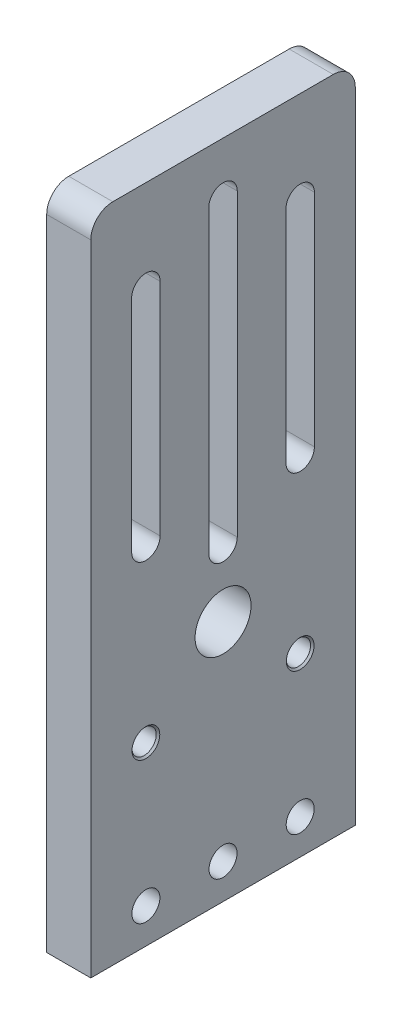
ISO-10303-21;
HEADER;
FILE_DESCRIPTION(('STEP AP214'),'2;1');
FILE_NAME('part.step','',(''),(''),'','','');
FILE_SCHEMA(('AUTOMOTIVE_DESIGN { 1 0 10303 214 1 1 1 1 }'));
ENDSEC;
DATA;
#1=APPLICATION_CONTEXT('core data for automotive mechanical design processes');
#2=APPLICATION_PROTOCOL_DEFINITION('international standard','automotive_design',2000,#1);
#3=PRODUCT_CONTEXT('',#1,'mechanical');
#4=PRODUCT('Part','Part','',(#3));
#5=PRODUCT_RELATED_PRODUCT_CATEGORY('part','',(#4));
#6=PRODUCT_DEFINITION_FORMATION('','',#4);
#7=PRODUCT_DEFINITION_CONTEXT('part definition',#1,'design');
#8=PRODUCT_DEFINITION('design','',#6,#7);
#9=PRODUCT_DEFINITION_SHAPE('','',#8);
#10=(LENGTH_UNIT() NAMED_UNIT(*) SI_UNIT(.MILLI.,.METRE.));
#11=(NAMED_UNIT(*) PLANE_ANGLE_UNIT() SI_UNIT($,.RADIAN.));
#12=(NAMED_UNIT(*) SI_UNIT($,.STERADIAN.) SOLID_ANGLE_UNIT());
#13=UNCERTAINTY_MEASURE_WITH_UNIT(LENGTH_MEASURE(1.E-05),#10,'distance_accuracy_value','');
#14=(GEOMETRIC_REPRESENTATION_CONTEXT(3) GLOBAL_UNCERTAINTY_ASSIGNED_CONTEXT((#13)) GLOBAL_UNIT_ASSIGNED_CONTEXT((#10,
#11,#12)) REPRESENTATION_CONTEXT('',''));
#15=CARTESIAN_POINT('',(0.,0.,0.));
#16=DIRECTION('',(0.,0.,1.));
#17=DIRECTION('',(1.,0.,0.));
#18=AXIS2_PLACEMENT_3D('',#15,#16,#17);
#19=CARTESIAN_POINT('',(140.,200.,0.));
#20=DIRECTION('',(-1.,0.,0.));
#21=DIRECTION('',(0.,0.,1.));
#22=AXIS2_PLACEMENT_3D('',#19,#20,#21);
#23=PLANE('',#22);
#24=CARTESIAN_POINT('',(139.99999999993,57.937500094,47.5));
#25=DIRECTION('',(1.,0.,0.));
#26=DIRECTION('',(0.,0.,-1.));
#27=AXIS2_PLACEMENT_3D('',#24,#25,#26);
#28=CIRCLE('',#27,3.175);
#29=CARTESIAN_POINT('',(139.99999999993,57.937500094,44.325));
#30=VERTEX_POINT('',#29);
#31=EDGE_CURVE('E682',#30,#30,#28,.T.);
#32=ORIENTED_EDGE('',*,*,#31,.T.);
#33=EDGE_LOOP('',(#32));
#34=FACE_BOUND('',#33,.T.);
#35=CARTESIAN_POINT('',(139.99999999993,57.937500094,12.5));
#36=DIRECTION('',(1.,0.,0.));
#37=DIRECTION('',(0.,0.,-1.));
#38=AXIS2_PLACEMENT_3D('',#35,#36,#37);
#39=CIRCLE('',#38,3.175);
#40=CARTESIAN_POINT('',(139.99999999993,57.937500094,9.325));
#41=VERTEX_POINT('',#40);
#42=EDGE_CURVE('E686',#41,#41,#39,.T.);
#43=ORIENTED_EDGE('',*,*,#42,.T.);
#44=EDGE_LOOP('',(#43));
#45=FACE_BOUND('',#44,.T.);
#46=CARTESIAN_POINT('',(139.99999999993,57.937500094,30.));
#47=DIRECTION('',(1.,0.,0.));
#48=DIRECTION('',(0.,0.,-1.));
#49=AXIS2_PLACEMENT_3D('',#46,#47,#48);
#50=CIRCLE('',#49,3.175);
#51=CARTESIAN_POINT('',(139.99999999993,57.937500094,26.825));
#52=VERTEX_POINT('',#51);
#53=EDGE_CURVE('E695',#52,#52,#50,.T.);
#54=ORIENTED_EDGE('',*,*,#53,.T.);
#55=EDGE_LOOP('',(#54));
#56=FACE_BOUND('',#55,.T.);
#57=DIRECTION('',(0.,1.,0.));
#58=VECTOR('',#57,1.);
#59=CARTESIAN_POINT('',(140.,200.,15.7258));
#60=LINE('',#59,#58);
#61=CARTESIAN_POINT('',(140.,129.000000086,15.7258));
#62=VERTEX_POINT('',#61);
#63=CARTESIAN_POINT('',(140.,179.000000086,15.7258));
#64=VERTEX_POINT('',#63);
#65=EDGE_CURVE('E460',#62,#64,#60,.T.);
#66=ORIENTED_EDGE('',*,*,#65,.F.);
#67=CARTESIAN_POINT('',(140.,129.000000086,12.5));
#68=DIRECTION('',(-1.,0.,0.));
#69=DIRECTION('',(0.,0.,1.));
#70=AXIS2_PLACEMENT_3D('',#67,#68,#69);
#71=CIRCLE('',#70,3.2258);
#72=CARTESIAN_POINT('',(140.,129.000000086,9.2742));
#73=VERTEX_POINT('',#72);
#74=EDGE_CURVE('E468',#73,#62,#71,.T.);
#75=ORIENTED_EDGE('',*,*,#74,.F.);
#76=DIRECTION('',(0.,-1.,0.));
#77=VECTOR('',#76,1.);
#78=CARTESIAN_POINT('',(140.,200.,9.27419999999973));
#79=LINE('',#78,#77);
#80=CARTESIAN_POINT('',(140.,179.000000086,9.27419999999981));
#81=VERTEX_POINT('',#80);
#82=EDGE_CURVE('E458',#81,#73,#79,.T.);
#83=ORIENTED_EDGE('',*,*,#82,.F.);
#84=CARTESIAN_POINT('',(140.,179.000000086,12.5));
#85=DIRECTION('',(-1.,0.,0.));
#86=DIRECTION('',(0.,0.,1.));
#87=AXIS2_PLACEMENT_3D('',#84,#85,#86);
#88=CIRCLE('',#87,3.2258);
#89=EDGE_CURVE('E293',#64,#81,#88,.T.);
#90=ORIENTED_EDGE('',*,*,#89,.F.);
#91=EDGE_LOOP('',(#66,#75,#83,#90));
#92=FACE_BOUND('',#91,.T.);
#93=DIRECTION('',(0.,1.,0.));
#94=VECTOR('',#93,1.);
#95=CARTESIAN_POINT('',(140.,200.,50.7258));
#96=LINE('',#95,#94);
#97=CARTESIAN_POINT('',(140.,129.000000086,50.7258));
#98=VERTEX_POINT('',#97);
#99=CARTESIAN_POINT('',(140.,179.000000086,50.7258));
#100=VERTEX_POINT('',#99);
#101=EDGE_CURVE('E455',#98,#100,#96,.T.);
#102=ORIENTED_EDGE('',*,*,#101,.F.);
#103=CARTESIAN_POINT('',(140.,129.000000086,47.5));
#104=DIRECTION('',(-1.,0.,0.));
#105=DIRECTION('',(0.,0.,1.));
#106=AXIS2_PLACEMENT_3D('',#103,#104,#105);
#107=CIRCLE('',#106,3.2258);
#108=CARTESIAN_POINT('',(140.,129.000000086,44.2742));
#109=VERTEX_POINT('',#108);
#110=EDGE_CURVE('E466',#109,#98,#107,.T.);
#111=ORIENTED_EDGE('',*,*,#110,.F.);
#112=DIRECTION('',(0.,1.,0.));
#113=VECTOR('',#112,1.);
#114=CARTESIAN_POINT('',(140.,200.,44.2741999999997));
#115=LINE('',#114,#113);
#116=CARTESIAN_POINT('',(140.,179.000000086,44.2741999999998));
#117=VERTEX_POINT('',#116);
#118=EDGE_CURVE('E452',#109,#117,#115,.T.);
#119=ORIENTED_EDGE('',*,*,#118,.T.);
#120=CARTESIAN_POINT('',(140.,179.000000086,47.5));
#121=DIRECTION('',(-1.,0.,0.));
#122=DIRECTION('',(0.,0.,1.));
#123=AXIS2_PLACEMENT_3D('',#120,#121,#122);
#124=CIRCLE('',#123,3.2258);
#125=EDGE_CURVE('E303',#100,#117,#124,.T.);
#126=ORIENTED_EDGE('',*,*,#125,.F.);
#127=EDGE_LOOP('',(#102,#111,#119,#126));
#128=FACE_BOUND('',#127,.T.);
#129=DIRECTION('',(0.,1.,0.));
#130=VECTOR('',#129,1.);
#131=CARTESIAN_POINT('',(140.,200.,33.2258));
#132=LINE('',#131,#130);
#133=CARTESIAN_POINT('',(140.,120.000000198,33.2258));
#134=VERTEX_POINT('',#133);
#135=CARTESIAN_POINT('',(140.,187.999999898,33.2258));
#136=VERTEX_POINT('',#135);
#137=EDGE_CURVE('E287',#134,#136,#132,.T.);
#138=ORIENTED_EDGE('',*,*,#137,.F.);
#139=CARTESIAN_POINT('',(140.,120.000000198,30.));
#140=DIRECTION('',(-1.,0.,0.));
#141=DIRECTION('',(0.,0.,1.));
#142=AXIS2_PLACEMENT_3D('',#139,#140,#141);
#143=CIRCLE('',#142,3.2258);
#144=CARTESIAN_POINT('',(140.,120.000000198,26.7742));
#145=VERTEX_POINT('',#144);
#146=EDGE_CURVE('E464',#145,#134,#143,.T.);
#147=ORIENTED_EDGE('',*,*,#146,.F.);
#148=DIRECTION('',(0.,-1.,0.));
#149=VECTOR('',#148,1.);
#150=CARTESIAN_POINT('',(140.,200.,26.7742));
#151=LINE('',#150,#149);
#152=CARTESIAN_POINT('',(140.,187.999999898,26.7742));
#153=VERTEX_POINT('',#152);
#154=EDGE_CURVE('E288',#153,#145,#151,.T.);
#155=ORIENTED_EDGE('',*,*,#154,.F.);
#156=CARTESIAN_POINT('',(140.,187.999999898,30.));
#157=DIRECTION('',(-1.,0.,0.));
#158=DIRECTION('',(0.,0.,1.));
#159=AXIS2_PLACEMENT_3D('',#156,#157,#158);
#160=CIRCLE('',#159,3.2258);
#161=EDGE_CURVE('E276',#136,#153,#160,.T.);
#162=ORIENTED_EDGE('',*,*,#161,.F.);
#163=EDGE_LOOP('',(#138,#147,#155,#162));
#164=FACE_BOUND('',#163,.T.);
#165=CARTESIAN_POINT('',(140.,105.,30.));
#166=DIRECTION('',(-1.,0.,0.));
#167=DIRECTION('',(0.,0.,1.));
#168=AXIS2_PLACEMENT_3D('',#165,#166,#167);
#169=CIRCLE('',#168,6.35);
#170=CARTESIAN_POINT('',(140.,105.,36.35));
#171=VERTEX_POINT('',#170);
#172=EDGE_CURVE('E289',#171,#171,#169,.T.);
#173=ORIENTED_EDGE('',*,*,#172,.F.);
#174=EDGE_LOOP('',(#173));
#175=FACE_BOUND('',#174,.T.);
#176=CARTESIAN_POINT('',(139.999999999986,90.,47.5));
#177=DIRECTION('',(-1.,0.,0.));
#178=DIRECTION('',(0.,0.,1.));
#179=AXIS2_PLACEMENT_3D('',#176,#177,#178);
#180=CIRCLE('',#179,3.15000000001874);
#181=CARTESIAN_POINT('',(139.999999999986,90.,50.6500000000187));
#182=VERTEX_POINT('',#181);
#183=EDGE_CURVE('E250',#182,#182,#180,.F.);
#184=ORIENTED_EDGE('',*,*,#183,.T.);
#185=EDGE_LOOP('',(#184));
#186=FACE_BOUND('',#185,.T.);
#187=CARTESIAN_POINT('',(139.99999999993,90.,12.5));
#188=DIRECTION('',(-1.,0.,0.));
#189=DIRECTION('',(0.,0.,1.));
#190=AXIS2_PLACEMENT_3D('',#187,#188,#189);
#191=CIRCLE('',#190,3.14999999999372);
#192=CARTESIAN_POINT('',(139.99999999993,90.,15.6499999999937));
#193=VERTEX_POINT('',#192);
#194=EDGE_CURVE('E254',#193,#193,#191,.F.);
#195=ORIENTED_EDGE('',*,*,#194,.T.);
#196=EDGE_LOOP('',(#195));
#197=FACE_BOUND('',#196,.T.);
#198=DIRECTION('',(0.,1.,0.));
#199=VECTOR('',#198,1.);
#200=CARTESIAN_POINT('',(140.,0.,0.));
#201=LINE('',#200,#199);
#202=CARTESIAN_POINT('',(140.,50.000000094,0.));
#203=VERTEX_POINT('',#202);
#204=CARTESIAN_POINT('',(140.,195.,0.));
#205=VERTEX_POINT('',#204);
#206=EDGE_CURVE('E197',#203,#205,#201,.T.);
#207=ORIENTED_EDGE('',*,*,#206,.F.);
#208=DIRECTION('',(0.,0.,1.));
#209=VECTOR('',#208,1.);
#210=CARTESIAN_POINT('',(140.,50.000000094,0.));
#211=LINE('',#210,#209);
#212=CARTESIAN_POINT('',(140.,50.000000094,60.));
#213=VERTEX_POINT('',#212);
#214=EDGE_CURVE('E179',#203,#213,#211,.T.);
#215=ORIENTED_EDGE('',*,*,#214,.T.);
#216=DIRECTION('',(0.,1.,0.));
#217=VECTOR('',#216,1.);
#218=CARTESIAN_POINT('',(140.,0.,60.));
#219=LINE('',#218,#217);
#220=CARTESIAN_POINT('',(140.,195.,60.));
#221=VERTEX_POINT('',#220);
#222=EDGE_CURVE('E178',#213,#221,#219,.T.);
#223=ORIENTED_EDGE('',*,*,#222,.T.);
#224=CARTESIAN_POINT('',(140.,195.,55.));
#225=DIRECTION('',(-1.,0.,0.));
#226=DIRECTION('',(0.,0.,1.));
#227=AXIS2_PLACEMENT_3D('',#224,#225,#226);
#228=CIRCLE('',#227,5.);
#229=CARTESIAN_POINT('',(140.,200.,55.));
#230=VERTEX_POINT('',#229);
#231=EDGE_CURVE('E246',#230,#221,#228,.F.);
#232=ORIENTED_EDGE('',*,*,#231,.F.);
#233=DIRECTION('',(0.,0.,-1.));
#234=VECTOR('',#233,1.);
#235=CARTESIAN_POINT('',(140.,200.,0.));
#236=LINE('',#235,#234);
#237=CARTESIAN_POINT('',(140.,200.,5.));
#238=VERTEX_POINT('',#237);
#239=EDGE_CURVE('E245',#230,#238,#236,.T.);
#240=ORIENTED_EDGE('',*,*,#239,.T.);
#241=CARTESIAN_POINT('',(140.,195.,5.));
#242=DIRECTION('',(1.,0.,0.));
#243=DIRECTION('',(0.,0.,-1.));
#244=AXIS2_PLACEMENT_3D('',#241,#242,#243);
#245=CIRCLE('',#244,5.);
#246=EDGE_CURVE('E242',#205,#238,#245,.T.);
#247=ORIENTED_EDGE('',*,*,#246,.F.);
#248=EDGE_LOOP('',(#207,#215,#223,#232,#240,#247));
#249=FACE_BOUND('',#248,.T.);
#250=ADVANCED_FACE('F43',(#34,#45,#56,#92,#128,#164,#175,#186,#197,#249),#23,.T.);
#251=CARTESIAN_POINT('',(150.,0.,60.));
#252=DIRECTION('',(0.,0.,-1.));
#253=DIRECTION('',(-1.,0.,0.));
#254=AXIS2_PLACEMENT_3D('',#251,#252,#253);
#255=PLANE('',#254);
#256=DIRECTION('',(-1.,0.,0.));
#257=VECTOR('',#256,1.);
#258=CARTESIAN_POINT('',(150.,50.000000094,60.));
#259=LINE('',#258,#257);
#260=CARTESIAN_POINT('',(150.,50.000000094,60.));
#261=VERTEX_POINT('',#260);
#262=EDGE_CURVE('E166',#261,#213,#259,.T.);
#263=ORIENTED_EDGE('',*,*,#262,.F.);
#264=DIRECTION('',(0.,1.,0.));
#265=VECTOR('',#264,1.);
#266=CARTESIAN_POINT('',(150.,200.,60.));
#267=LINE('',#266,#265);
#268=CARTESIAN_POINT('',(150.,195.,60.));
#269=VERTEX_POINT('',#268);
#270=EDGE_CURVE('E176',#261,#269,#267,.T.);
#271=ORIENTED_EDGE('',*,*,#270,.T.);
#272=DIRECTION('',(-1.,0.,0.));
#273=VECTOR('',#272,1.);
#274=CARTESIAN_POINT('',(150.,195.,60.));
#275=LINE('',#274,#273);
#276=EDGE_CURVE('E249',#221,#269,#275,.F.);
#277=ORIENTED_EDGE('',*,*,#276,.F.);
#278=ORIENTED_EDGE('',*,*,#222,.F.);
#279=EDGE_LOOP('',(#263,#271,#277,#278));
#280=FACE_BOUND('',#279,.T.);
#281=ADVANCED_FACE('F174',(#280),#255,.F.);
#282=CARTESIAN_POINT('',(150.,0.,0.));
#283=DIRECTION('',(0.,0.,-1.));
#284=DIRECTION('',(-1.,0.,0.));
#285=AXIS2_PLACEMENT_3D('',#282,#283,#284);
#286=PLANE('',#285);
#287=DIRECTION('',(0.,1.,0.));
#288=VECTOR('',#287,1.);
#289=CARTESIAN_POINT('',(150.,200.,0.));
#290=LINE('',#289,#288);
#291=CARTESIAN_POINT('',(150.,195.,0.));
#292=VERTEX_POINT('',#291);
#293=CARTESIAN_POINT('',(150.,50.000000094,0.));
#294=VERTEX_POINT('',#293);
#295=EDGE_CURVE('E261',#292,#294,#290,.F.);
#296=ORIENTED_EDGE('',*,*,#295,.T.);
#297=DIRECTION('',(-1.,0.,0.));
#298=VECTOR('',#297,1.);
#299=CARTESIAN_POINT('',(150.,50.000000094,0.));
#300=LINE('',#299,#298);
#301=EDGE_CURVE('E57',#294,#203,#300,.T.);
#302=ORIENTED_EDGE('',*,*,#301,.T.);
#303=ORIENTED_EDGE('',*,*,#206,.T.);
#304=DIRECTION('',(-1.,0.,0.));
#305=VECTOR('',#304,1.);
#306=CARTESIAN_POINT('',(150.,195.,0.));
#307=LINE('',#306,#305);
#308=EDGE_CURVE('E240',#205,#292,#307,.F.);
#309=ORIENTED_EDGE('',*,*,#308,.T.);
#310=EDGE_LOOP('',(#296,#302,#303,#309));
#311=FACE_BOUND('',#310,.T.);
#312=ADVANCED_FACE('F342',(#311),#286,.T.);
#313=CARTESIAN_POINT('',(150.,200.,0.));
#314=DIRECTION('',(-1.,0.,0.));
#315=DIRECTION('',(0.,0.,1.));
#316=AXIS2_PLACEMENT_3D('',#313,#314,#315);
#317=PLANE('',#316);
#318=CARTESIAN_POINT('',(150.,57.937500094,47.5));
#319=DIRECTION('',(1.,0.,0.));
#320=DIRECTION('',(0.,0.,-1.));
#321=AXIS2_PLACEMENT_3D('',#318,#319,#320);
#322=CIRCLE('',#321,3.175);
#323=CARTESIAN_POINT('',(150.,57.937500094,44.325));
#324=VERTEX_POINT('',#323);
#325=EDGE_CURVE('E685',#324,#324,#322,.T.);
#326=ORIENTED_EDGE('',*,*,#325,.F.);
#327=EDGE_LOOP('',(#326));
#328=FACE_BOUND('',#327,.T.);
#329=CARTESIAN_POINT('',(150.,57.937500094,12.5));
#330=DIRECTION('',(1.,0.,0.));
#331=DIRECTION('',(0.,0.,-1.));
#332=AXIS2_PLACEMENT_3D('',#329,#330,#331);
#333=CIRCLE('',#332,3.175);
#334=CARTESIAN_POINT('',(150.,57.937500094,9.325));
#335=VERTEX_POINT('',#334);
#336=EDGE_CURVE('E690',#335,#335,#333,.T.);
#337=ORIENTED_EDGE('',*,*,#336,.F.);
#338=EDGE_LOOP('',(#337));
#339=FACE_BOUND('',#338,.T.);
#340=CARTESIAN_POINT('',(150.,57.937500094,30.));
#341=DIRECTION('',(1.,0.,0.));
#342=DIRECTION('',(0.,0.,-1.));
#343=AXIS2_PLACEMENT_3D('',#340,#341,#342);
#344=CIRCLE('',#343,3.175);
#345=CARTESIAN_POINT('',(150.,57.937500094,26.825));
#346=VERTEX_POINT('',#345);
#347=EDGE_CURVE('E698',#346,#346,#344,.T.);
#348=ORIENTED_EDGE('',*,*,#347,.F.);
#349=EDGE_LOOP('',(#348));
#350=FACE_BOUND('',#349,.T.);
#351=CARTESIAN_POINT('',(149.99999999992,90.,12.5));
#352=DIRECTION('',(1.,0.,0.));
#353=DIRECTION('',(0.,0.,-1.));
#354=AXIS2_PLACEMENT_3D('',#351,#352,#353);
#355=CIRCLE('',#354,3.14999999995962);
#356=CARTESIAN_POINT('',(149.99999999992,90.,9.35000000004038));
#357=VERTEX_POINT('',#356);
#358=EDGE_CURVE('E191',#357,#357,#355,.T.);
#359=ORIENTED_EDGE('',*,*,#358,.F.);
#360=EDGE_LOOP('',(#359));
#361=FACE_BOUND('',#360,.T.);
#362=CARTESIAN_POINT('',(150.000000000034,90.,47.5));
#363=DIRECTION('',(1.,0.,0.));
#364=DIRECTION('',(0.,0.,-1.));
#365=AXIS2_PLACEMENT_3D('',#362,#363,#364);
#366=CIRCLE('',#365,3.15000000004829);
#367=CARTESIAN_POINT('',(150.000000000034,90.,44.3499999999517));
#368=VERTEX_POINT('',#367);
#369=EDGE_CURVE('E186',#368,#368,#366,.T.);
#370=ORIENTED_EDGE('',*,*,#369,.F.);
#371=EDGE_LOOP('',(#370));
#372=FACE_BOUND('',#371,.T.);
#373=CARTESIAN_POINT('',(150.,120.000000198,30.));
#374=DIRECTION('',(1.,0.,0.));
#375=DIRECTION('',(0.,0.,-1.));
#376=AXIS2_PLACEMENT_3D('',#373,#374,#375);
#377=CIRCLE('',#376,3.2258);
#378=CARTESIAN_POINT('',(150.,120.000000198,33.2258));
#379=VERTEX_POINT('',#378);
#380=CARTESIAN_POINT('',(150.,120.000000198,26.7742));
#381=VERTEX_POINT('',#380);
#382=EDGE_CURVE('E414',#379,#381,#377,.T.);
#383=ORIENTED_EDGE('',*,*,#382,.F.);
#384=DIRECTION('',(0.,-1.,0.));
#385=VECTOR('',#384,1.);
#386=CARTESIAN_POINT('',(150.,187.999999898,33.2258));
#387=LINE('',#386,#385);
#388=CARTESIAN_POINT('',(150.,187.999999898,33.2258));
#389=VERTEX_POINT('',#388);
#390=EDGE_CURVE('E443',#389,#379,#387,.T.);
#391=ORIENTED_EDGE('',*,*,#390,.F.);
#392=CARTESIAN_POINT('',(150.,187.999999898,30.));
#393=DIRECTION('',(1.,0.,0.));
#394=DIRECTION('',(0.,0.,-1.));
#395=AXIS2_PLACEMENT_3D('',#392,#393,#394);
#396=CIRCLE('',#395,3.2258);
#397=CARTESIAN_POINT('',(150.,187.999999898,26.7742));
#398=VERTEX_POINT('',#397);
#399=EDGE_CURVE('E278',#398,#389,#396,.T.);
#400=ORIENTED_EDGE('',*,*,#399,.F.);
#401=DIRECTION('',(0.,1.,0.));
#402=VECTOR('',#401,1.);
#403=CARTESIAN_POINT('',(150.,120.000000198,26.7742));
#404=LINE('',#403,#402);
#405=EDGE_CURVE('E65',#381,#398,#404,.T.);
#406=ORIENTED_EDGE('',*,*,#405,.F.);
#407=EDGE_LOOP('',(#383,#391,#400,#406));
#408=FACE_BOUND('',#407,.T.);
#409=CARTESIAN_POINT('',(150.,105.,30.));
#410=DIRECTION('',(1.,0.,0.));
#411=DIRECTION('',(0.,0.,-1.));
#412=AXIS2_PLACEMENT_3D('',#409,#410,#411);
#413=CIRCLE('',#412,6.35);
#414=CARTESIAN_POINT('',(150.,105.,23.65));
#415=VERTEX_POINT('',#414);
#416=EDGE_CURVE('E418',#415,#415,#413,.T.);
#417=ORIENTED_EDGE('',*,*,#416,.F.);
#418=EDGE_LOOP('',(#417));
#419=FACE_BOUND('',#418,.T.);
#420=CARTESIAN_POINT('',(150.,129.000000086,12.5));
#421=DIRECTION('',(1.,0.,0.));
#422=DIRECTION('',(0.,0.,-1.));
#423=AXIS2_PLACEMENT_3D('',#420,#421,#422);
#424=CIRCLE('',#423,3.2258);
#425=CARTESIAN_POINT('',(150.,129.000000086,15.7258));
#426=VERTEX_POINT('',#425);
#427=CARTESIAN_POINT('',(150.,129.000000086,9.2742));
#428=VERTEX_POINT('',#427);
#429=EDGE_CURVE('E424',#426,#428,#424,.T.);
#430=ORIENTED_EDGE('',*,*,#429,.F.);
#431=DIRECTION('',(0.,-1.,0.));
#432=VECTOR('',#431,1.);
#433=CARTESIAN_POINT('',(150.,0.,15.7258));
#434=LINE('',#433,#432);
#435=CARTESIAN_POINT('',(150.,179.000000086,15.7258));
#436=VERTEX_POINT('',#435);
#437=EDGE_CURVE('E436',#436,#426,#434,.T.);
#438=ORIENTED_EDGE('',*,*,#437,.F.);
#439=CARTESIAN_POINT('',(150.,179.000000086,12.5));
#440=DIRECTION('',(1.,0.,0.));
#441=DIRECTION('',(0.,0.,-1.));
#442=AXIS2_PLACEMENT_3D('',#439,#440,#441);
#443=CIRCLE('',#442,3.2258);
#444=CARTESIAN_POINT('',(150.,179.000000086,9.2742));
#445=VERTEX_POINT('',#444);
#446=EDGE_CURVE('E296',#445,#436,#443,.T.);
#447=ORIENTED_EDGE('',*,*,#446,.F.);
#448=DIRECTION('',(0.,1.,0.));
#449=VECTOR('',#448,1.);
#450=CARTESIAN_POINT('',(150.,0.,9.27420000000051));
#451=LINE('',#450,#449);
#452=EDGE_CURVE('E704',#428,#445,#451,.T.);
#453=ORIENTED_EDGE('',*,*,#452,.F.);
#454=EDGE_LOOP('',(#430,#438,#447,#453));
#455=FACE_BOUND('',#454,.T.);
#456=CARTESIAN_POINT('',(150.,129.000000086,47.5));
#457=DIRECTION('',(1.,0.,0.));
#458=DIRECTION('',(0.,0.,-1.));
#459=AXIS2_PLACEMENT_3D('',#456,#457,#458);
#460=CIRCLE('',#459,3.2258);
#461=CARTESIAN_POINT('',(150.,129.000000086,50.7258));
#462=VERTEX_POINT('',#461);
#463=CARTESIAN_POINT('',(150.,129.000000086,44.2742));
#464=VERTEX_POINT('',#463);
#465=EDGE_CURVE('E429',#462,#464,#460,.T.);
#466=ORIENTED_EDGE('',*,*,#465,.F.);
#467=DIRECTION('',(0.,-1.,0.));
#468=VECTOR('',#467,1.);
#469=CARTESIAN_POINT('',(150.,0.,50.7258));
#470=LINE('',#469,#468);
#471=CARTESIAN_POINT('',(150.,179.000000086,50.7258));
#472=VERTEX_POINT('',#471);
#473=EDGE_CURVE('E432',#472,#462,#470,.T.);
#474=ORIENTED_EDGE('',*,*,#473,.F.);
#475=CARTESIAN_POINT('',(150.,179.000000086,47.5));
#476=DIRECTION('',(1.,0.,0.));
#477=DIRECTION('',(0.,0.,-1.));
#478=AXIS2_PLACEMENT_3D('',#475,#476,#477);
#479=CIRCLE('',#478,3.2258);
#480=CARTESIAN_POINT('',(150.,179.000000086,44.2742));
#481=VERTEX_POINT('',#480);
#482=EDGE_CURVE('E290',#481,#472,#479,.T.);
#483=ORIENTED_EDGE('',*,*,#482,.F.);
#484=DIRECTION('',(0.,-1.,0.));
#485=VECTOR('',#484,1.);
#486=CARTESIAN_POINT('',(150.,1.72039826829009E-13,44.2742000000005));
#487=LINE('',#486,#485);
#488=EDGE_CURVE('E433',#481,#464,#487,.T.);
#489=ORIENTED_EDGE('',*,*,#488,.T.);
#490=EDGE_LOOP('',(#466,#474,#483,#489));
#491=FACE_BOUND('',#490,.T.);
#492=DIRECTION('',(0.,0.,1.));
#493=VECTOR('',#492,1.);
#494=CARTESIAN_POINT('',(150.,50.000000094,0.));
#495=LINE('',#494,#493);
#496=EDGE_CURVE('E12',#294,#261,#495,.T.);
#497=ORIENTED_EDGE('',*,*,#496,.F.);
#498=ORIENTED_EDGE('',*,*,#295,.F.);
#499=CARTESIAN_POINT('',(150.,195.,5.));
#500=DIRECTION('',(1.,0.,0.));
#501=DIRECTION('',(0.,0.,-1.));
#502=AXIS2_PLACEMENT_3D('',#499,#500,#501);
#503=CIRCLE('',#502,5.);
#504=CARTESIAN_POINT('',(150.,200.,5.));
#505=VERTEX_POINT('',#504);
#506=EDGE_CURVE('E306',#505,#292,#503,.F.);
#507=ORIENTED_EDGE('',*,*,#506,.F.);
#508=DIRECTION('',(0.,0.,1.));
#509=VECTOR('',#508,1.);
#510=CARTESIAN_POINT('',(150.,200.,0.));
#511=LINE('',#510,#509);
#512=CARTESIAN_POINT('',(150.,200.,55.));
#513=VERTEX_POINT('',#512);
#514=EDGE_CURVE('E188',#513,#505,#511,.F.);
#515=ORIENTED_EDGE('',*,*,#514,.F.);
#516=CARTESIAN_POINT('',(150.,195.,55.));
#517=DIRECTION('',(-1.,0.,0.));
#518=DIRECTION('',(0.,0.,1.));
#519=AXIS2_PLACEMENT_3D('',#516,#517,#518);
#520=CIRCLE('',#519,5.);
#521=EDGE_CURVE('E185',#269,#513,#520,.T.);
#522=ORIENTED_EDGE('',*,*,#521,.F.);
#523=ORIENTED_EDGE('',*,*,#270,.F.);
#524=EDGE_LOOP('',(#497,#498,#507,#515,#522,#523));
#525=FACE_BOUND('',#524,.T.);
#526=ADVANCED_FACE('F182',(#328,#339,#350,#361,#372,#408,#419,#455,#491,#525),#317,.F.);
#527=CARTESIAN_POINT('',(139.99999999993,90.,12.5));
#528=DIRECTION('',(-1.,0.,0.));
#529=DIRECTION('',(0.,0.,1.));
#530=AXIS2_PLACEMENT_3D('',#527,#528,#529);
#531=CONICAL_SURFACE('',#530,3.14999999999372,0.785398162473743);
#532=ORIENTED_EDGE('',*,*,#194,.F.);
#533=EDGE_LOOP('',(#532));
#534=FACE_BOUND('',#533,.T.);
#535=CARTESIAN_POINT('',(140.4,90.,12.5));
#536=DIRECTION('',(1.,0.,0.));
#537=DIRECTION('',(0.,0.,-1.));
#538=AXIS2_PLACEMENT_3D('',#535,#536,#537);
#539=CIRCLE('',#538,2.75);
#540=CARTESIAN_POINT('',(140.4,90.,9.75));
#541=VERTEX_POINT('',#540);
#542=EDGE_CURVE('E305',#541,#541,#539,.T.);
#543=ORIENTED_EDGE('',*,*,#542,.T.);
#544=EDGE_LOOP('',(#543));
#545=FACE_BOUND('',#544,.T.);
#546=ADVANCED_FACE('F45',(#534,#545),#531,.F.);
#547=CARTESIAN_POINT('',(140.0000000001,90.,47.5));
#548=DIRECTION('',(-1.,0.,0.));
#549=DIRECTION('',(0.,0.,1.));
#550=AXIS2_PLACEMENT_3D('',#547,#548,#549);
#551=CONICAL_SURFACE('',#550,3.14999999990505,0.785398162473743);
#552=ORIENTED_EDGE('',*,*,#183,.F.);
#553=EDGE_LOOP('',(#552));
#554=FACE_BOUND('',#553,.T.);
#555=CARTESIAN_POINT('',(140.4,90.,47.5));
#556=DIRECTION('',(1.,0.,0.));
#557=DIRECTION('',(0.,0.,-1.));
#558=AXIS2_PLACEMENT_3D('',#555,#556,#557);
#559=CIRCLE('',#558,2.75);
#560=CARTESIAN_POINT('',(140.4,90.,44.75));
#561=VERTEX_POINT('',#560);
#562=EDGE_CURVE('E257',#561,#561,#559,.T.);
#563=ORIENTED_EDGE('',*,*,#562,.T.);
#564=EDGE_LOOP('',(#563));
#565=FACE_BOUND('',#564,.T.);
#566=ADVANCED_FACE('F384',(#554,#565),#551,.F.);
#567=CARTESIAN_POINT('',(140.,90.,12.5));
#568=DIRECTION('',(1.,0.,0.));
#569=DIRECTION('',(0.,0.,-1.));
#570=AXIS2_PLACEMENT_3D('',#567,#568,#569);
#571=CYLINDRICAL_SURFACE('',#570,2.75);
#572=ORIENTED_EDGE('',*,*,#542,.F.);
#573=EDGE_LOOP('',(#572));
#574=FACE_BOUND('',#573,.T.);
#575=CARTESIAN_POINT('',(149.599999999623,90.,12.5));
#576=DIRECTION('',(1.,0.,0.));
#577=DIRECTION('',(0.,0.,-1.));
#578=AXIS2_PLACEMENT_3D('',#575,#576,#577);
#579=CIRCLE('',#578,2.75000000034424);
#580=CARTESIAN_POINT('',(149.599999999623,90.,9.74999999965576));
#581=VERTEX_POINT('',#580);
#582=EDGE_CURVE('E253',#581,#581,#579,.T.);
#583=ORIENTED_EDGE('',*,*,#582,.T.);
#584=EDGE_LOOP('',(#583));
#585=FACE_BOUND('',#584,.T.);
#586=ADVANCED_FACE('F381',(#574,#585),#571,.F.);
#587=CARTESIAN_POINT('',(140.,90.,47.5));
#588=DIRECTION('',(1.,0.,0.));
#589=DIRECTION('',(0.,0.,-1.));
#590=AXIS2_PLACEMENT_3D('',#587,#588,#589);
#591=CYLINDRICAL_SURFACE('',#590,2.75);
#592=ORIENTED_EDGE('',*,*,#562,.F.);
#593=EDGE_LOOP('',(#592));
#594=FACE_BOUND('',#593,.T.);
#595=CARTESIAN_POINT('',(149.599999999623,90.,47.5));
#596=DIRECTION('',(1.,0.,0.));
#597=DIRECTION('',(0.,0.,-1.));
#598=AXIS2_PLACEMENT_3D('',#595,#596,#597);
#599=CIRCLE('',#598,2.75000000031923);
#600=CARTESIAN_POINT('',(149.599999999623,90.,44.7499999996808));
#601=VERTEX_POINT('',#600);
#602=EDGE_CURVE('E331',#601,#601,#599,.T.);
#603=ORIENTED_EDGE('',*,*,#602,.T.);
#604=EDGE_LOOP('',(#603));
#605=FACE_BOUND('',#604,.T.);
#606=ADVANCED_FACE('F378',(#594,#605),#591,.F.);
#607=CARTESIAN_POINT('',(149.999999999864,90.,12.5));
#608=DIRECTION('',(1.,0.,0.));
#609=DIRECTION('',(0.,0.,-1.));
#610=AXIS2_PLACEMENT_3D('',#607,#608,#609);
#611=CONICAL_SURFACE('',#610,3.14999999990278,0.785398162473743);
#612=ORIENTED_EDGE('',*,*,#358,.T.);
#613=EDGE_LOOP('',(#612));
#614=FACE_BOUND('',#613,.T.);
#615=ORIENTED_EDGE('',*,*,#582,.F.);
#616=EDGE_LOOP('',(#615));
#617=FACE_BOUND('',#616,.T.);
#618=ADVANCED_FACE('F376',(#614,#617),#611,.F.);
#619=CARTESIAN_POINT('',(149.99999999992,90.,47.5));
#620=DIRECTION('',(1.,0.,0.));
#621=DIRECTION('',(0.,0.,-1.));
#622=AXIS2_PLACEMENT_3D('',#619,#620,#621);
#623=CONICAL_SURFACE('',#622,3.14999999993461,0.785398162473743);
#624=ORIENTED_EDGE('',*,*,#369,.T.);
#625=EDGE_LOOP('',(#624));
#626=FACE_BOUND('',#625,.T.);
#627=ORIENTED_EDGE('',*,*,#602,.F.);
#628=EDGE_LOOP('',(#627));
#629=FACE_BOUND('',#628,.T.);
#630=ADVANCED_FACE('F398',(#626,#629),#623,.F.);
#631=CARTESIAN_POINT('',(150.,195.,55.));
#632=DIRECTION('',(-1.,0.,0.));
#633=DIRECTION('',(0.,0.,1.));
#634=AXIS2_PLACEMENT_3D('',#631,#632,#633);
#635=CYLINDRICAL_SURFACE('',#634,5.);
#636=ORIENTED_EDGE('',*,*,#231,.T.);
#637=ORIENTED_EDGE('',*,*,#276,.T.);
#638=ORIENTED_EDGE('',*,*,#521,.T.);
#639=DIRECTION('',(1.,0.,0.));
#640=VECTOR('',#639,1.);
#641=CARTESIAN_POINT('',(150.,200.,55.));
#642=LINE('',#641,#640);
#643=EDGE_CURVE('E326',#513,#230,#642,.F.);
#644=ORIENTED_EDGE('',*,*,#643,.T.);
#645=EDGE_LOOP('',(#636,#637,#638,#644));
#646=FACE_BOUND('',#645,.T.);
#647=ADVANCED_FACE('F357',(#646),#635,.T.);
#648=CARTESIAN_POINT('',(150.,200.,0.));
#649=DIRECTION('',(0.,-1.,0.));
#650=DIRECTION('',(0.,0.,-1.));
#651=AXIS2_PLACEMENT_3D('',#648,#649,#650);
#652=PLANE('',#651);
#653=DIRECTION('',(1.,0.,0.));
#654=VECTOR('',#653,1.);
#655=CARTESIAN_POINT('',(150.,200.,5.));
#656=LINE('',#655,#654);
#657=EDGE_CURVE('E244',#238,#505,#656,.T.);
#658=ORIENTED_EDGE('',*,*,#657,.F.);
#659=ORIENTED_EDGE('',*,*,#239,.F.);
#660=ORIENTED_EDGE('',*,*,#643,.F.);
#661=ORIENTED_EDGE('',*,*,#514,.T.);
#662=EDGE_LOOP('',(#658,#659,#660,#661));
#663=FACE_BOUND('',#662,.T.);
#664=ADVANCED_FACE('F348',(#663),#652,.F.);
#665=CARTESIAN_POINT('',(150.,195.,5.));
#666=DIRECTION('',(1.,0.,0.));
#667=DIRECTION('',(0.,0.,-1.));
#668=AXIS2_PLACEMENT_3D('',#665,#666,#667);
#669=CYLINDRICAL_SURFACE('',#668,5.);
#670=ORIENTED_EDGE('',*,*,#246,.T.);
#671=ORIENTED_EDGE('',*,*,#657,.T.);
#672=ORIENTED_EDGE('',*,*,#506,.T.);
#673=ORIENTED_EDGE('',*,*,#308,.F.);
#674=EDGE_LOOP('',(#670,#671,#672,#673));
#675=FACE_BOUND('',#674,.T.);
#676=ADVANCED_FACE('F346',(#675),#669,.T.);
#677=CARTESIAN_POINT('',(0.,187.999999898,30.));
#678=DIRECTION('',(1.,0.,0.));
#679=DIRECTION('',(0.,0.,-1.));
#680=AXIS2_PLACEMENT_3D('',#677,#678,#679);
#681=CYLINDRICAL_SURFACE('',#680,3.2258);
#682=ORIENTED_EDGE('',*,*,#399,.T.);
#683=DIRECTION('',(1.,0.,0.));
#684=VECTOR('',#683,1.);
#685=CARTESIAN_POINT('',(0.,187.999999898,33.2258));
#686=LINE('',#685,#684);
#687=EDGE_CURVE('E51',#389,#136,#686,.F.);
#688=ORIENTED_EDGE('',*,*,#687,.T.);
#689=ORIENTED_EDGE('',*,*,#161,.T.);
#690=DIRECTION('',(1.,0.,0.));
#691=VECTOR('',#690,1.);
#692=CARTESIAN_POINT('',(0.,187.999999898,26.7742));
#693=LINE('',#692,#691);
#694=EDGE_CURVE('E269',#398,#153,#693,.F.);
#695=ORIENTED_EDGE('',*,*,#694,.F.);
#696=EDGE_LOOP('',(#682,#688,#689,#695));
#697=FACE_BOUND('',#696,.T.);
#698=ADVANCED_FACE('F275',(#697),#681,.F.);
#699=CARTESIAN_POINT('',(0.,105.,30.));
#700=DIRECTION('',(1.,0.,0.));
#701=DIRECTION('',(0.,0.,-1.));
#702=AXIS2_PLACEMENT_3D('',#699,#700,#701);
#703=CYLINDRICAL_SURFACE('',#702,6.35);
#704=ORIENTED_EDGE('',*,*,#172,.T.);
#705=EDGE_LOOP('',(#704));
#706=FACE_BOUND('',#705,.T.);
#707=ORIENTED_EDGE('',*,*,#416,.T.);
#708=EDGE_LOOP('',(#707));
#709=FACE_BOUND('',#708,.T.);
#710=ADVANCED_FACE('F355',(#706,#709),#703,.F.);
#711=CARTESIAN_POINT('',(0.,179.000000086,12.5));
#712=DIRECTION('',(1.,0.,0.));
#713=DIRECTION('',(0.,0.,-1.));
#714=AXIS2_PLACEMENT_3D('',#711,#712,#713);
#715=CYLINDRICAL_SURFACE('',#714,3.2258);
#716=ORIENTED_EDGE('',*,*,#446,.T.);
#717=DIRECTION('',(1.,0.,0.));
#718=VECTOR('',#717,1.);
#719=CARTESIAN_POINT('',(0.,179.000000086,15.7258));
#720=LINE('',#719,#718);
#721=EDGE_CURVE('E266',#436,#64,#720,.F.);
#722=ORIENTED_EDGE('',*,*,#721,.T.);
#723=ORIENTED_EDGE('',*,*,#89,.T.);
#724=DIRECTION('',(1.,0.,0.));
#725=VECTOR('',#724,1.);
#726=CARTESIAN_POINT('',(0.,179.000000086,9.27419999999991));
#727=LINE('',#726,#725);
#728=EDGE_CURVE('E264',#445,#81,#727,.F.);
#729=ORIENTED_EDGE('',*,*,#728,.F.);
#730=EDGE_LOOP('',(#716,#722,#723,#729));
#731=FACE_BOUND('',#730,.T.);
#732=ADVANCED_FACE('F473',(#731),#715,.F.);
#733=CARTESIAN_POINT('',(0.,179.000000086,47.5));
#734=DIRECTION('',(1.,0.,0.));
#735=DIRECTION('',(0.,0.,-1.));
#736=AXIS2_PLACEMENT_3D('',#733,#734,#735);
#737=CYLINDRICAL_SURFACE('',#736,3.2258);
#738=ORIENTED_EDGE('',*,*,#482,.T.);
#739=DIRECTION('',(1.,0.,0.));
#740=VECTOR('',#739,1.);
#741=CARTESIAN_POINT('',(0.,179.000000086,50.7258));
#742=LINE('',#741,#740);
#743=EDGE_CURVE('E260',#472,#100,#742,.F.);
#744=ORIENTED_EDGE('',*,*,#743,.T.);
#745=ORIENTED_EDGE('',*,*,#125,.T.);
#746=DIRECTION('',(1.,0.,0.));
#747=VECTOR('',#746,1.);
#748=CARTESIAN_POINT('',(0.,179.000000086,44.2741999999999));
#749=LINE('',#748,#747);
#750=EDGE_CURVE('E258',#481,#117,#749,.F.);
#751=ORIENTED_EDGE('',*,*,#750,.F.);
#752=EDGE_LOOP('',(#738,#744,#745,#751));
#753=FACE_BOUND('',#752,.T.);
#754=ADVANCED_FACE('F479',(#753),#737,.F.);
#755=CARTESIAN_POINT('',(0.,129.000000086,47.5));
#756=DIRECTION('',(1.,0.,0.));
#757=DIRECTION('',(0.,0.,-1.));
#758=AXIS2_PLACEMENT_3D('',#755,#756,#757);
#759=CYLINDRICAL_SURFACE('',#758,3.2258);
#760=ORIENTED_EDGE('',*,*,#110,.T.);
#761=DIRECTION('',(1.,0.,0.));
#762=VECTOR('',#761,1.);
#763=CARTESIAN_POINT('',(0.,129.000000086,50.7258));
#764=LINE('',#763,#762);
#765=EDGE_CURVE('E446',#98,#462,#764,.T.);
#766=ORIENTED_EDGE('',*,*,#765,.T.);
#767=ORIENTED_EDGE('',*,*,#465,.T.);
#768=DIRECTION('',(1.,0.,0.));
#769=VECTOR('',#768,1.);
#770=CARTESIAN_POINT('',(0.,129.000000086,44.2742));
#771=LINE('',#770,#769);
#772=EDGE_CURVE('E709',#109,#464,#771,.T.);
#773=ORIENTED_EDGE('',*,*,#772,.F.);
#774=EDGE_LOOP('',(#760,#766,#767,#773));
#775=FACE_BOUND('',#774,.T.);
#776=ADVANCED_FACE('F522',(#775),#759,.F.);
#777=CARTESIAN_POINT('',(0.,0.,50.7258));
#778=DIRECTION('',(0.,0.,1.));
#779=DIRECTION('',(1.,0.,0.));
#780=AXIS2_PLACEMENT_3D('',#777,#778,#779);
#781=PLANE('',#780);
#782=ORIENTED_EDGE('',*,*,#101,.T.);
#783=ORIENTED_EDGE('',*,*,#743,.F.);
#784=ORIENTED_EDGE('',*,*,#473,.T.);
#785=ORIENTED_EDGE('',*,*,#765,.F.);
#786=EDGE_LOOP('',(#782,#783,#784,#785));
#787=FACE_BOUND('',#786,.T.);
#788=ADVANCED_FACE('F530',(#787),#781,.F.);
#789=CARTESIAN_POINT('',(0.,1.72039826829009E-13,44.2742000000005));
#790=DIRECTION('',(0.,0.,1.));
#791=DIRECTION('',(0.,-1.,0.));
#792=AXIS2_PLACEMENT_3D('',#789,#790,#791);
#793=PLANE('',#792);
#794=ORIENTED_EDGE('',*,*,#772,.T.);
#795=ORIENTED_EDGE('',*,*,#488,.F.);
#796=ORIENTED_EDGE('',*,*,#750,.T.);
#797=ORIENTED_EDGE('',*,*,#118,.F.);
#798=EDGE_LOOP('',(#794,#795,#796,#797));
#799=FACE_BOUND('',#798,.T.);
#800=ADVANCED_FACE('F538',(#799),#793,.T.);
#801=CARTESIAN_POINT('',(0.,0.,15.7258));
#802=DIRECTION('',(0.,0.,1.));
#803=DIRECTION('',(0.,-1.,0.));
#804=AXIS2_PLACEMENT_3D('',#801,#802,#803);
#805=PLANE('',#804);
#806=ORIENTED_EDGE('',*,*,#65,.T.);
#807=ORIENTED_EDGE('',*,*,#721,.F.);
#808=ORIENTED_EDGE('',*,*,#437,.T.);
#809=DIRECTION('',(1.,0.,0.));
#810=VECTOR('',#809,1.);
#811=CARTESIAN_POINT('',(0.,129.000000086,15.7258));
#812=LINE('',#811,#810);
#813=EDGE_CURVE('E706',#62,#426,#812,.T.);
#814=ORIENTED_EDGE('',*,*,#813,.F.);
#815=EDGE_LOOP('',(#806,#807,#808,#814));
#816=FACE_BOUND('',#815,.T.);
#817=ADVANCED_FACE('F547',(#816),#805,.F.);
#818=CARTESIAN_POINT('',(0.,0.,9.27420000000051));
#819=DIRECTION('',(0.,0.,-1.));
#820=DIRECTION('',(0.,1.,0.));
#821=AXIS2_PLACEMENT_3D('',#818,#819,#820);
#822=PLANE('',#821);
#823=ORIENTED_EDGE('',*,*,#82,.T.);
#824=DIRECTION('',(1.,0.,0.));
#825=VECTOR('',#824,1.);
#826=CARTESIAN_POINT('',(0.,129.000000086,9.2742));
#827=LINE('',#826,#825);
#828=EDGE_CURVE('E456',#73,#428,#827,.T.);
#829=ORIENTED_EDGE('',*,*,#828,.T.);
#830=ORIENTED_EDGE('',*,*,#452,.T.);
#831=ORIENTED_EDGE('',*,*,#728,.T.);
#832=EDGE_LOOP('',(#823,#829,#830,#831));
#833=FACE_BOUND('',#832,.T.);
#834=ADVANCED_FACE('F556',(#833),#822,.F.);
#835=CARTESIAN_POINT('',(0.,129.000000086,12.5));
#836=DIRECTION('',(1.,0.,0.));
#837=DIRECTION('',(0.,0.,-1.));
#838=AXIS2_PLACEMENT_3D('',#835,#836,#837);
#839=CYLINDRICAL_SURFACE('',#838,3.2258);
#840=ORIENTED_EDGE('',*,*,#74,.T.);
#841=ORIENTED_EDGE('',*,*,#813,.T.);
#842=ORIENTED_EDGE('',*,*,#429,.T.);
#843=ORIENTED_EDGE('',*,*,#828,.F.);
#844=EDGE_LOOP('',(#840,#841,#842,#843));
#845=FACE_BOUND('',#844,.T.);
#846=ADVANCED_FACE('F565',(#845),#839,.F.);
#847=CARTESIAN_POINT('',(0.,120.000000198,30.));
#848=DIRECTION('',(1.,0.,0.));
#849=DIRECTION('',(0.,0.,-1.));
#850=AXIS2_PLACEMENT_3D('',#847,#848,#849);
#851=CYLINDRICAL_SURFACE('',#850,3.2258);
#852=ORIENTED_EDGE('',*,*,#146,.T.);
#853=DIRECTION('',(1.,0.,0.));
#854=VECTOR('',#853,1.);
#855=CARTESIAN_POINT('',(0.,120.000000198,33.2258));
#856=LINE('',#855,#854);
#857=EDGE_CURVE('E447',#134,#379,#856,.T.);
#858=ORIENTED_EDGE('',*,*,#857,.T.);
#859=ORIENTED_EDGE('',*,*,#382,.T.);
#860=DIRECTION('',(1.,0.,0.));
#861=VECTOR('',#860,1.);
#862=CARTESIAN_POINT('',(0.,120.000000198,26.7742));
#863=LINE('',#862,#861);
#864=EDGE_CURVE('E449',#145,#381,#863,.T.);
#865=ORIENTED_EDGE('',*,*,#864,.F.);
#866=EDGE_LOOP('',(#852,#858,#859,#865));
#867=FACE_BOUND('',#866,.T.);
#868=ADVANCED_FACE('F574',(#867),#851,.F.);
#869=CARTESIAN_POINT('',(0.,187.999999898,33.2258));
#870=DIRECTION('',(0.,0.,1.));
#871=DIRECTION('',(0.,-1.,0.));
#872=AXIS2_PLACEMENT_3D('',#869,#870,#871);
#873=PLANE('',#872);
#874=ORIENTED_EDGE('',*,*,#137,.T.);
#875=ORIENTED_EDGE('',*,*,#687,.F.);
#876=ORIENTED_EDGE('',*,*,#390,.T.);
#877=ORIENTED_EDGE('',*,*,#857,.F.);
#878=EDGE_LOOP('',(#874,#875,#876,#877));
#879=FACE_BOUND('',#878,.T.);
#880=ADVANCED_FACE('F577',(#879),#873,.F.);
#881=CARTESIAN_POINT('',(0.,120.000000198,26.7742));
#882=DIRECTION('',(0.,0.,-1.));
#883=DIRECTION('',(0.,1.,0.));
#884=AXIS2_PLACEMENT_3D('',#881,#882,#883);
#885=PLANE('',#884);
#886=ORIENTED_EDGE('',*,*,#154,.T.);
#887=ORIENTED_EDGE('',*,*,#864,.T.);
#888=ORIENTED_EDGE('',*,*,#405,.T.);
#889=ORIENTED_EDGE('',*,*,#694,.T.);
#890=EDGE_LOOP('',(#886,#887,#888,#889));
#891=FACE_BOUND('',#890,.T.);
#892=ADVANCED_FACE('F586',(#891),#885,.F.);
#893=CARTESIAN_POINT('',(0.,50.000000094,0.));
#894=DIRECTION('',(0.,-1.,0.));
#895=DIRECTION('',(0.,0.,-1.));
#896=AXIS2_PLACEMENT_3D('',#893,#894,#895);
#897=PLANE('',#896);
#898=ORIENTED_EDGE('',*,*,#301,.F.);
#899=ORIENTED_EDGE('',*,*,#496,.T.);
#900=ORIENTED_EDGE('',*,*,#262,.T.);
#901=ORIENTED_EDGE('',*,*,#214,.F.);
#902=EDGE_LOOP('',(#898,#899,#900,#901));
#903=FACE_BOUND('',#902,.T.);
#904=ADVANCED_FACE('F165',(#903),#897,.T.);
#905=CARTESIAN_POINT('',(139.99999999993,57.937500094,30.));
#906=DIRECTION('',(1.,0.,0.));
#907=DIRECTION('',(0.,0.,-1.));
#908=AXIS2_PLACEMENT_3D('',#905,#906,#907);
#909=CYLINDRICAL_SURFACE('',#908,3.175);
#910=ORIENTED_EDGE('',*,*,#53,.F.);
#911=EDGE_LOOP('',(#910));
#912=FACE_BOUND('',#911,.T.);
#913=ORIENTED_EDGE('',*,*,#347,.T.);
#914=EDGE_LOOP('',(#913));
#915=FACE_BOUND('',#914,.T.);
#916=ADVANCED_FACE('F626',(#912,#915),#909,.F.);
#917=CARTESIAN_POINT('',(139.99999999993,57.937500094,12.5));
#918=DIRECTION('',(1.,0.,0.));
#919=DIRECTION('',(0.,0.,-1.));
#920=AXIS2_PLACEMENT_3D('',#917,#918,#919);
#921=CYLINDRICAL_SURFACE('',#920,3.175);
#922=ORIENTED_EDGE('',*,*,#42,.F.);
#923=EDGE_LOOP('',(#922));
#924=FACE_BOUND('',#923,.T.);
#925=ORIENTED_EDGE('',*,*,#336,.T.);
#926=EDGE_LOOP('',(#925));
#927=FACE_BOUND('',#926,.T.);
#928=ADVANCED_FACE('F635',(#924,#927),#921,.F.);
#929=CARTESIAN_POINT('',(139.99999999993,57.937500094,47.5));
#930=DIRECTION('',(1.,0.,0.));
#931=DIRECTION('',(0.,0.,-1.));
#932=AXIS2_PLACEMENT_3D('',#929,#930,#931);
#933=CYLINDRICAL_SURFACE('',#932,3.175);
#934=ORIENTED_EDGE('',*,*,#31,.F.);
#935=EDGE_LOOP('',(#934));
#936=FACE_BOUND('',#935,.T.);
#937=ORIENTED_EDGE('',*,*,#325,.T.);
#938=EDGE_LOOP('',(#937));
#939=FACE_BOUND('',#938,.T.);
#940=ADVANCED_FACE('F645',(#936,#939),#933,.F.);
#941=CLOSED_SHELL('',(#250,#281,#312,#526,#546,#566,#586,#606,#618,#630,#647,#664,#676,#698,
#710,#732,#754,#776,#788,#800,#817,#834,#846,#868,#880,#892,#904,#916,#928,#940));
#942=MANIFOLD_SOLID_BREP('B2',#941);
#943=ADVANCED_BREP_SHAPE_REPRESENTATION('',(#18,#942),#14);
#944=SHAPE_DEFINITION_REPRESENTATION(#9,#943);
ENDSEC;
END-ISO-10303-21;
